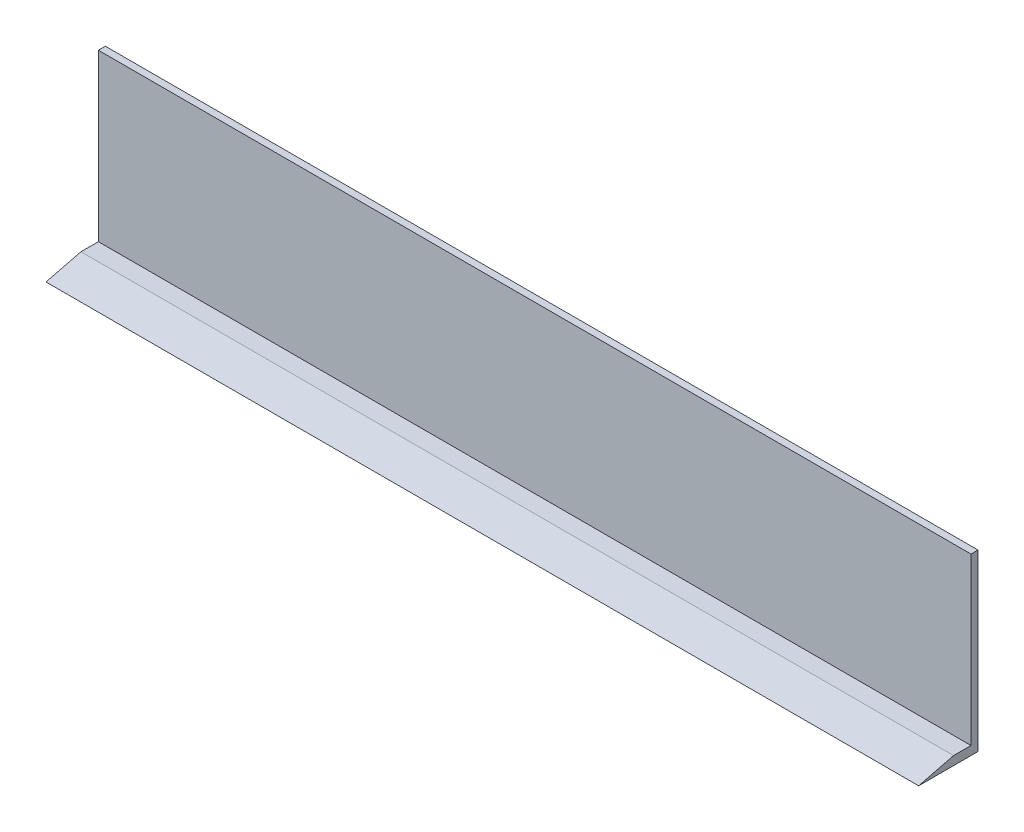
ISO-10303-21;
HEADER;
FILE_DESCRIPTION(('STEP AP214'),'2;1');
FILE_NAME('part.step','',(''),(''),'','','');
FILE_SCHEMA(('AUTOMOTIVE_DESIGN { 1 0 10303 214 1 1 1 1 }'));
ENDSEC;
DATA;
#1=APPLICATION_CONTEXT('core data for automotive mechanical design processes');
#2=APPLICATION_PROTOCOL_DEFINITION('international standard','automotive_design',2000,#1);
#3=PRODUCT_CONTEXT('',#1,'mechanical');
#4=PRODUCT('Part','Part','',(#3));
#5=PRODUCT_RELATED_PRODUCT_CATEGORY('part','',(#4));
#6=PRODUCT_DEFINITION_FORMATION('','',#4);
#7=PRODUCT_DEFINITION_CONTEXT('part definition',#1,'design');
#8=PRODUCT_DEFINITION('design','',#6,#7);
#9=PRODUCT_DEFINITION_SHAPE('','',#8);
#10=(LENGTH_UNIT() NAMED_UNIT(*) SI_UNIT(.MILLI.,.METRE.));
#11=(NAMED_UNIT(*) PLANE_ANGLE_UNIT() SI_UNIT($,.RADIAN.));
#12=(NAMED_UNIT(*) SI_UNIT($,.STERADIAN.) SOLID_ANGLE_UNIT());
#13=UNCERTAINTY_MEASURE_WITH_UNIT(LENGTH_MEASURE(1.E-05),#10,'distance_accuracy_value','');
#14=(GEOMETRIC_REPRESENTATION_CONTEXT(3) GLOBAL_UNCERTAINTY_ASSIGNED_CONTEXT((#13)) GLOBAL_UNIT_ASSIGNED_CONTEXT((#10,
#11,#12)) REPRESENTATION_CONTEXT('',''));
#15=CARTESIAN_POINT('',(0.,0.,0.));
#16=DIRECTION('',(0.,0.,1.));
#17=DIRECTION('',(1.,0.,0.));
#18=AXIS2_PLACEMENT_3D('',#15,#16,#17);
#19=CARTESIAN_POINT('',(0.,0.,2.));
#20=DIRECTION('',(0.,0.,1.));
#21=DIRECTION('',(1.,0.,0.));
#22=AXIS2_PLACEMENT_3D('',#19,#20,#21);
#23=PLANE('',#22);
#24=DIRECTION('',(0.,-1.,0.));
#25=VECTOR('',#24,1.);
#26=CARTESIAN_POINT('',(-250.,0.,2.));
#27=LINE('',#26,#25);
#28=CARTESIAN_POINT('',(-250.,50.,2.));
#29=VERTEX_POINT('',#28);
#30=CARTESIAN_POINT('',(-250.,2.5,2.));
#31=VERTEX_POINT('',#30);
#32=EDGE_CURVE('E101',#29,#31,#27,.T.);
#33=ORIENTED_EDGE('',*,*,#32,.T.);
#34=DIRECTION('',(1.,0.,0.));
#35=VECTOR('',#34,1.);
#36=CARTESIAN_POINT('',(-250.,2.5,2.));
#37=LINE('',#36,#35);
#38=CARTESIAN_POINT('',(0.,2.5,2.));
#39=VERTEX_POINT('',#38);
#40=EDGE_CURVE('E127',#31,#39,#37,.T.);
#41=ORIENTED_EDGE('',*,*,#40,.T.);
#42=DIRECTION('',(0.,1.,0.));
#43=VECTOR('',#42,1.);
#44=CARTESIAN_POINT('',(0.,0.,2.));
#45=LINE('',#44,#43);
#46=CARTESIAN_POINT('',(0.,50.,2.));
#47=VERTEX_POINT('',#46);
#48=EDGE_CURVE('E91',#39,#47,#45,.T.);
#49=ORIENTED_EDGE('',*,*,#48,.T.);
#50=DIRECTION('',(-1.,0.,0.));
#51=VECTOR('',#50,1.);
#52=CARTESIAN_POINT('',(0.,50.,2.));
#53=LINE('',#52,#51);
#54=EDGE_CURVE('E59',#47,#29,#53,.T.);
#55=ORIENTED_EDGE('',*,*,#54,.T.);
#56=EDGE_LOOP('',(#33,#41,#49,#55));
#57=FACE_BOUND('',#56,.T.);
#58=ADVANCED_FACE('F33',(#57),#23,.T.);
#59=CARTESIAN_POINT('',(0.,0.,2.));
#60=DIRECTION('',(-1.,0.,0.));
#61=DIRECTION('',(0.,0.,1.));
#62=AXIS2_PLACEMENT_3D('',#59,#60,#61);
#63=PLANE('',#62);
#64=DIRECTION('',(0.,1.,0.));
#65=VECTOR('',#64,1.);
#66=CARTESIAN_POINT('',(0.,0.,0.));
#67=LINE('',#66,#65);
#68=CARTESIAN_POINT('',(0.,0.,0.));
#69=VERTEX_POINT('',#68);
#70=CARTESIAN_POINT('',(0.,50.,0.));
#71=VERTEX_POINT('',#70);
#72=EDGE_CURVE('E98',#69,#71,#67,.T.);
#73=ORIENTED_EDGE('',*,*,#72,.T.);
#74=DIRECTION('',(0.,0.,-1.));
#75=VECTOR('',#74,1.);
#76=CARTESIAN_POINT('',(0.,50.,2.));
#77=LINE('',#76,#75);
#78=EDGE_CURVE('E11',#47,#71,#77,.T.);
#79=ORIENTED_EDGE('',*,*,#78,.F.);
#80=ORIENTED_EDGE('',*,*,#48,.F.);
#81=DIRECTION('',(0.,0.,1.));
#82=VECTOR('',#81,1.);
#83=CARTESIAN_POINT('',(0.,2.5,2.));
#84=LINE('',#83,#82);
#85=CARTESIAN_POINT('',(0.,2.5,7.));
#86=VERTEX_POINT('',#85);
#87=EDGE_CURVE('E50',#39,#86,#84,.T.);
#88=ORIENTED_EDGE('',*,*,#87,.T.);
#89=DIRECTION('',(0.,-0.242535625036333,0.970142500145332));
#90=VECTOR('',#89,1.);
#91=CARTESIAN_POINT('',(0.,0.,17.));
#92=LINE('',#91,#90);
#93=CARTESIAN_POINT('',(0.,0.,17.));
#94=VERTEX_POINT('',#93);
#95=EDGE_CURVE('E100',#86,#94,#92,.T.);
#96=ORIENTED_EDGE('',*,*,#95,.T.);
#97=DIRECTION('',(0.,0.,-1.));
#98=VECTOR('',#97,1.);
#99=CARTESIAN_POINT('',(0.,0.,2.));
#100=LINE('',#99,#98);
#101=EDGE_CURVE('E84',#94,#69,#100,.T.);
#102=ORIENTED_EDGE('',*,*,#101,.T.);
#103=EDGE_LOOP('',(#73,#79,#80,#88,#96,#102));
#104=FACE_BOUND('',#103,.T.);
#105=ADVANCED_FACE('F35',(#104),#63,.F.);
#106=CARTESIAN_POINT('',(0.,50.,2.));
#107=DIRECTION('',(0.,-1.,0.));
#108=DIRECTION('',(1.,0.,0.));
#109=AXIS2_PLACEMENT_3D('',#106,#107,#108);
#110=PLANE('',#109);
#111=DIRECTION('',(-1.,0.,0.));
#112=VECTOR('',#111,1.);
#113=CARTESIAN_POINT('',(0.,50.,0.));
#114=LINE('',#113,#112);
#115=CARTESIAN_POINT('',(-250.,50.,0.));
#116=VERTEX_POINT('',#115);
#117=EDGE_CURVE('E104',#71,#116,#114,.T.);
#118=ORIENTED_EDGE('',*,*,#117,.T.);
#119=DIRECTION('',(0.,0.,-1.));
#120=VECTOR('',#119,1.);
#121=CARTESIAN_POINT('',(-250.,50.,2.));
#122=LINE('',#121,#120);
#123=EDGE_CURVE('E42',#29,#116,#122,.T.);
#124=ORIENTED_EDGE('',*,*,#123,.F.);
#125=ORIENTED_EDGE('',*,*,#54,.F.);
#126=ORIENTED_EDGE('',*,*,#78,.T.);
#127=EDGE_LOOP('',(#118,#124,#125,#126));
#128=FACE_BOUND('',#127,.T.);
#129=ADVANCED_FACE('F165',(#128),#110,.F.);
#130=CARTESIAN_POINT('',(-250.,0.,2.));
#131=DIRECTION('',(1.,0.,0.));
#132=DIRECTION('',(0.,0.,-1.));
#133=AXIS2_PLACEMENT_3D('',#130,#131,#132);
#134=PLANE('',#133);
#135=DIRECTION('',(0.,-1.,0.));
#136=VECTOR('',#135,1.);
#137=CARTESIAN_POINT('',(-250.,0.,0.));
#138=LINE('',#137,#136);
#139=CARTESIAN_POINT('',(-250.,0.,0.));
#140=VERTEX_POINT('',#139);
#141=EDGE_CURVE('E92',#116,#140,#138,.T.);
#142=ORIENTED_EDGE('',*,*,#141,.T.);
#143=DIRECTION('',(0.,0.,-1.));
#144=VECTOR('',#143,1.);
#145=CARTESIAN_POINT('',(-250.,0.,2.));
#146=LINE('',#145,#144);
#147=CARTESIAN_POINT('',(-250.,0.,17.));
#148=VERTEX_POINT('',#147);
#149=EDGE_CURVE('E87',#148,#140,#146,.T.);
#150=ORIENTED_EDGE('',*,*,#149,.F.);
#151=DIRECTION('',(0.,-0.242535625036333,0.970142500145332));
#152=VECTOR('',#151,1.);
#153=CARTESIAN_POINT('',(-250.,0.,17.));
#154=LINE('',#153,#152);
#155=CARTESIAN_POINT('',(-250.,2.5,7.));
#156=VERTEX_POINT('',#155);
#157=EDGE_CURVE('E138',#156,#148,#154,.T.);
#158=ORIENTED_EDGE('',*,*,#157,.F.);
#159=DIRECTION('',(0.,0.,1.));
#160=VECTOR('',#159,1.);
#161=CARTESIAN_POINT('',(-250.,2.5,2.));
#162=LINE('',#161,#160);
#163=EDGE_CURVE('E136',#31,#156,#162,.T.);
#164=ORIENTED_EDGE('',*,*,#163,.F.);
#165=ORIENTED_EDGE('',*,*,#32,.F.);
#166=ORIENTED_EDGE('',*,*,#123,.T.);
#167=EDGE_LOOP('',(#142,#150,#158,#164,#165,#166));
#168=FACE_BOUND('',#167,.T.);
#169=ADVANCED_FACE('F133',(#168),#134,.F.);
#170=CARTESIAN_POINT('',(0.,0.,2.));
#171=DIRECTION('',(0.,1.,0.));
#172=DIRECTION('',(-1.,0.,0.));
#173=AXIS2_PLACEMENT_3D('',#170,#171,#172);
#174=PLANE('',#173);
#175=DIRECTION('',(1.,0.,0.));
#176=VECTOR('',#175,1.);
#177=CARTESIAN_POINT('',(0.,0.,0.));
#178=LINE('',#177,#176);
#179=EDGE_CURVE('E79',#140,#69,#178,.T.);
#180=ORIENTED_EDGE('',*,*,#179,.T.);
#181=ORIENTED_EDGE('',*,*,#101,.F.);
#182=DIRECTION('',(1.,0.,0.));
#183=VECTOR('',#182,1.);
#184=CARTESIAN_POINT('',(-250.,0.,17.));
#185=LINE('',#184,#183);
#186=EDGE_CURVE('E105',#148,#94,#185,.T.);
#187=ORIENTED_EDGE('',*,*,#186,.F.);
#188=ORIENTED_EDGE('',*,*,#149,.T.);
#189=EDGE_LOOP('',(#180,#181,#187,#188));
#190=FACE_BOUND('',#189,.T.);
#191=ADVANCED_FACE('F81',(#190),#174,.F.);
#192=CARTESIAN_POINT('',(0.,0.,0.));
#193=DIRECTION('',(0.,0.,1.));
#194=DIRECTION('',(1.,0.,0.));
#195=AXIS2_PLACEMENT_3D('',#192,#193,#194);
#196=PLANE('',#195);
#197=ORIENTED_EDGE('',*,*,#72,.F.);
#198=ORIENTED_EDGE('',*,*,#179,.F.);
#199=ORIENTED_EDGE('',*,*,#141,.F.);
#200=ORIENTED_EDGE('',*,*,#117,.F.);
#201=EDGE_LOOP('',(#197,#198,#199,#200));
#202=FACE_BOUND('',#201,.T.);
#203=ADVANCED_FACE('F103',(#202),#196,.F.);
#204=CARTESIAN_POINT('',(-250.,0.,17.));
#205=DIRECTION('',(0.,0.970142500145332,0.242535625036333));
#206=DIRECTION('',(0.,-0.242535625036333,0.970142500145332));
#207=AXIS2_PLACEMENT_3D('',#204,#205,#206);
#208=PLANE('',#207);
#209=ORIENTED_EDGE('',*,*,#95,.F.);
#210=DIRECTION('',(1.,0.,0.));
#211=VECTOR('',#210,1.);
#212=CARTESIAN_POINT('',(-250.,2.5,7.));
#213=LINE('',#212,#211);
#214=EDGE_CURVE('E108',#156,#86,#213,.T.);
#215=ORIENTED_EDGE('',*,*,#214,.F.);
#216=ORIENTED_EDGE('',*,*,#157,.T.);
#217=ORIENTED_EDGE('',*,*,#186,.T.);
#218=EDGE_LOOP('',(#209,#215,#216,#217));
#219=FACE_BOUND('',#218,.T.);
#220=ADVANCED_FACE('F150',(#219),#208,.T.);
#221=CARTESIAN_POINT('',(-250.,2.5,2.));
#222=DIRECTION('',(0.,1.,0.));
#223=DIRECTION('',(0.,0.,1.));
#224=AXIS2_PLACEMENT_3D('',#221,#222,#223);
#225=PLANE('',#224);
#226=ORIENTED_EDGE('',*,*,#87,.F.);
#227=ORIENTED_EDGE('',*,*,#40,.F.);
#228=ORIENTED_EDGE('',*,*,#163,.T.);
#229=ORIENTED_EDGE('',*,*,#214,.T.);
#230=EDGE_LOOP('',(#226,#227,#228,#229));
#231=FACE_BOUND('',#230,.T.);
#232=ADVANCED_FACE('F152',(#231),#225,.T.);
#233=CLOSED_SHELL('',(#58,#105,#129,#169,#191,#203,#220,#232));
#234=MANIFOLD_SOLID_BREP('B2',#233);
#235=ADVANCED_BREP_SHAPE_REPRESENTATION('',(#18,#234),#14);
#236=SHAPE_DEFINITION_REPRESENTATION(#9,#235);
ENDSEC;
END-ISO-10303-21;
